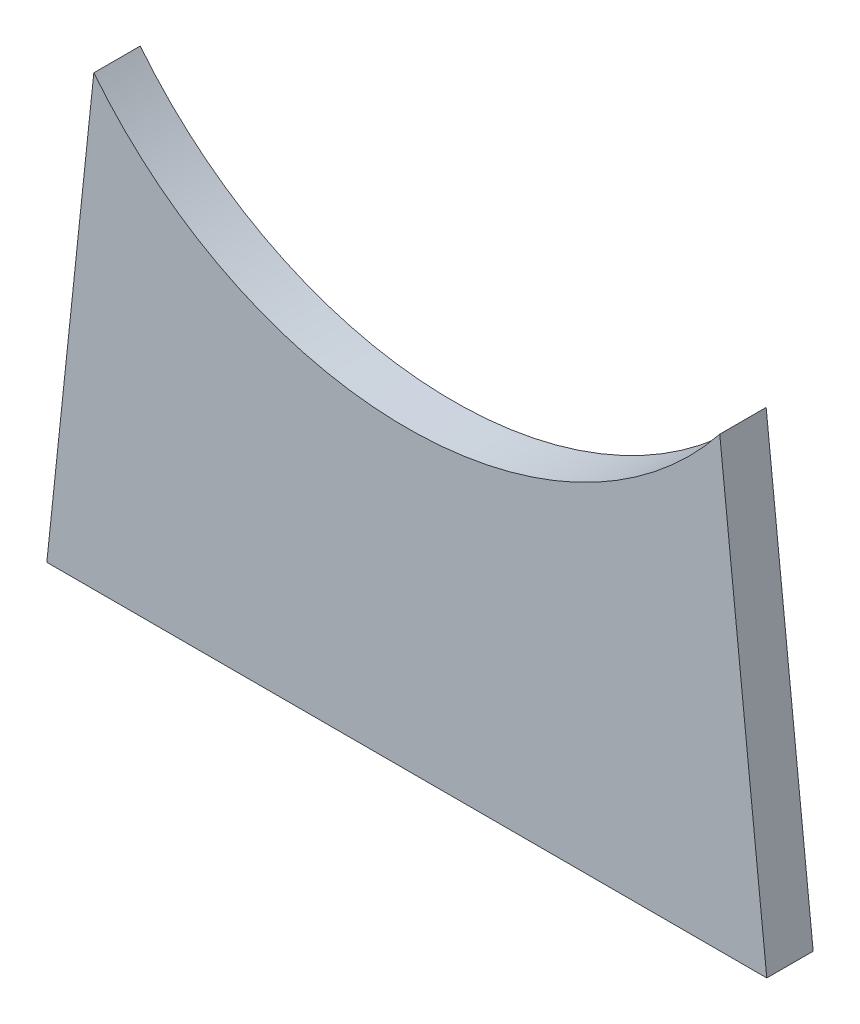
ISO-10303-21;
HEADER;
FILE_DESCRIPTION(('STEP AP214'),'2;1');
FILE_NAME('part.step','',(''),(''),'','','');
FILE_SCHEMA(('AUTOMOTIVE_DESIGN { 1 0 10303 214 1 1 1 1 }'));
ENDSEC;
DATA;
#1=APPLICATION_CONTEXT('core data for automotive mechanical design processes');
#2=APPLICATION_PROTOCOL_DEFINITION('international standard','automotive_design',2000,#1);
#3=PRODUCT_CONTEXT('',#1,'mechanical');
#4=PRODUCT('Part','Part','',(#3));
#5=PRODUCT_RELATED_PRODUCT_CATEGORY('part','',(#4));
#6=PRODUCT_DEFINITION_FORMATION('','',#4);
#7=PRODUCT_DEFINITION_CONTEXT('part definition',#1,'design');
#8=PRODUCT_DEFINITION('design','',#6,#7);
#9=PRODUCT_DEFINITION_SHAPE('','',#8);
#10=(LENGTH_UNIT() NAMED_UNIT(*) SI_UNIT(.MILLI.,.METRE.));
#11=(NAMED_UNIT(*) PLANE_ANGLE_UNIT() SI_UNIT($,.RADIAN.));
#12=(NAMED_UNIT(*) SI_UNIT($,.STERADIAN.) SOLID_ANGLE_UNIT());
#13=UNCERTAINTY_MEASURE_WITH_UNIT(LENGTH_MEASURE(1.E-05),#10,'distance_accuracy_value','');
#14=(GEOMETRIC_REPRESENTATION_CONTEXT(3) GLOBAL_UNCERTAINTY_ASSIGNED_CONTEXT((#13)) GLOBAL_UNIT_ASSIGNED_CONTEXT((#10,
#11,#12)) REPRESENTATION_CONTEXT('',''));
#15=CARTESIAN_POINT('',(0.,0.,0.));
#16=DIRECTION('',(0.,0.,1.));
#17=DIRECTION('',(1.,0.,0.));
#18=AXIS2_PLACEMENT_3D('',#15,#16,#17);
#19=CARTESIAN_POINT('',(-1978.1275,0.,127.5));
#20=DIRECTION('',(0.994521895368273,-0.104528463267658,0.));
#21=DIRECTION('',(0.104528463267658,0.994521895368273,0.));
#22=AXIS2_PLACEMENT_3D('',#19,#20,#21);
#23=PLANE('',#22);
#24=DIRECTION('',(-0.104528463267658,-0.994521895368273,0.));
#25=VECTOR('',#24,1.);
#26=CARTESIAN_POINT('',(-1978.1275,0.,-127.5));
#27=LINE('',#26,#25);
#28=CARTESIAN_POINT('',(-1719.70246154051,2458.75,-127.5));
#29=VERTEX_POINT('',#28);
#30=CARTESIAN_POINT('',(-1978.1275,0.,-127.5));
#31=VERTEX_POINT('',#30);
#32=EDGE_CURVE('E96',#29,#31,#27,.T.);
#33=ORIENTED_EDGE('',*,*,#32,.T.);
#34=DIRECTION('',(0.,0.,-1.));
#35=VECTOR('',#34,1.);
#36=CARTESIAN_POINT('',(-1978.1275,0.,127.5));
#37=LINE('',#36,#35);
#38=CARTESIAN_POINT('',(-1978.1275,0.,127.5));
#39=VERTEX_POINT('',#38);
#40=EDGE_CURVE('E11',#39,#31,#37,.T.);
#41=ORIENTED_EDGE('',*,*,#40,.F.);
#42=DIRECTION('',(-0.104528463267658,-0.994521895368273,0.));
#43=VECTOR('',#42,1.);
#44=CARTESIAN_POINT('',(-1978.1275,0.,127.5));
#45=LINE('',#44,#43);
#46=CARTESIAN_POINT('',(-1719.70246154051,2458.75,127.5));
#47=VERTEX_POINT('',#46);
#48=EDGE_CURVE('E84',#47,#39,#45,.T.);
#49=ORIENTED_EDGE('',*,*,#48,.F.);
#50=DIRECTION('',(0.,0.,-1.));
#51=VECTOR('',#50,1.);
#52=CARTESIAN_POINT('',(-1719.70246154051,2458.75,127.5));
#53=LINE('',#52,#51);
#54=EDGE_CURVE('E92',#47,#29,#53,.T.);
#55=ORIENTED_EDGE('',*,*,#54,.T.);
#56=EDGE_LOOP('',(#33,#41,#49,#55));
#57=FACE_BOUND('',#56,.T.);
#58=ADVANCED_FACE('F33',(#57),#23,.F.);
#59=CARTESIAN_POINT('',(-1978.1275,0.,127.5));
#60=DIRECTION('',(0.,1.,0.));
#61=DIRECTION('',(0.,0.,1.));
#62=AXIS2_PLACEMENT_3D('',#59,#60,#61);
#63=PLANE('',#62);
#64=DIRECTION('',(1.,0.,0.));
#65=VECTOR('',#64,1.);
#66=CARTESIAN_POINT('',(-1978.1275,0.,-127.5));
#67=LINE('',#66,#65);
#68=CARTESIAN_POINT('',(1978.1275,0.,-127.5));
#69=VERTEX_POINT('',#68);
#70=EDGE_CURVE('E88',#31,#69,#67,.T.);
#71=ORIENTED_EDGE('',*,*,#70,.T.);
#72=DIRECTION('',(0.,0.,-1.));
#73=VECTOR('',#72,1.);
#74=CARTESIAN_POINT('',(1978.1275,0.,127.5));
#75=LINE('',#74,#73);
#76=CARTESIAN_POINT('',(1978.1275,0.,127.5));
#77=VERTEX_POINT('',#76);
#78=EDGE_CURVE('E41',#77,#69,#75,.T.);
#79=ORIENTED_EDGE('',*,*,#78,.F.);
#80=DIRECTION('',(1.,0.,0.));
#81=VECTOR('',#80,1.);
#82=CARTESIAN_POINT('',(-1978.1275,0.,127.5));
#83=LINE('',#82,#81);
#84=EDGE_CURVE('E79',#39,#77,#83,.T.);
#85=ORIENTED_EDGE('',*,*,#84,.F.);
#86=ORIENTED_EDGE('',*,*,#40,.T.);
#87=EDGE_LOOP('',(#71,#79,#85,#86));
#88=FACE_BOUND('',#87,.T.);
#89=ADVANCED_FACE('F87',(#88),#63,.F.);
#90=CARTESIAN_POINT('',(1978.1275,0.,127.5));
#91=DIRECTION('',(-0.994521895368273,-0.104528463267658,0.));
#92=DIRECTION('',(0.104528463267658,-0.994521895368273,0.));
#93=AXIS2_PLACEMENT_3D('',#90,#91,#92);
#94=PLANE('',#93);
#95=DIRECTION('',(-0.104528463267658,0.994521895368273,0.));
#96=VECTOR('',#95,1.);
#97=CARTESIAN_POINT('',(1978.1275,0.,-127.5));
#98=LINE('',#97,#96);
#99=CARTESIAN_POINT('',(1719.70246154051,2458.75,-127.5));
#100=VERTEX_POINT('',#99);
#101=EDGE_CURVE('E66',#69,#100,#98,.T.);
#102=ORIENTED_EDGE('',*,*,#101,.T.);
#103=DIRECTION('',(0.,0.,-1.));
#104=VECTOR('',#103,1.);
#105=CARTESIAN_POINT('',(1719.70246154051,2458.75,127.5));
#106=LINE('',#105,#104);
#107=CARTESIAN_POINT('',(1719.70246154051,2458.75,127.5));
#108=VERTEX_POINT('',#107);
#109=EDGE_CURVE('E89',#108,#100,#106,.T.);
#110=ORIENTED_EDGE('',*,*,#109,.F.);
#111=DIRECTION('',(-0.104528463267658,0.994521895368273,0.));
#112=VECTOR('',#111,1.);
#113=CARTESIAN_POINT('',(1978.1275,0.,127.5));
#114=LINE('',#113,#112);
#115=EDGE_CURVE('E82',#77,#108,#114,.T.);
#116=ORIENTED_EDGE('',*,*,#115,.F.);
#117=ORIENTED_EDGE('',*,*,#78,.T.);
#118=EDGE_LOOP('',(#102,#110,#116,#117));
#119=FACE_BOUND('',#118,.T.);
#120=ADVANCED_FACE('F90',(#119),#94,.F.);
#121=CARTESIAN_POINT('',(0.,3824.4466296259,127.5));
#122=DIRECTION('',(0.,0.,-1.));
#123=DIRECTION('',(-1.,0.,0.));
#124=AXIS2_PLACEMENT_3D('',#121,#122,#123);
#125=CYLINDRICAL_SURFACE('',#124,2196.02);
#126=CARTESIAN_POINT('',(0.,3824.4466296259,-127.5));
#127=DIRECTION('',(0.,0.,-1.));
#128=DIRECTION('',(1.,0.,0.));
#129=AXIS2_PLACEMENT_3D('',#126,#127,#128);
#130=CIRCLE('',#129,2196.02);
#131=EDGE_CURVE('E72',#100,#29,#130,.T.);
#132=ORIENTED_EDGE('',*,*,#131,.T.);
#133=ORIENTED_EDGE('',*,*,#54,.F.);
#134=CARTESIAN_POINT('',(0.,3824.4466296259,127.5));
#135=DIRECTION('',(0.,0.,-1.));
#136=DIRECTION('',(1.,0.,0.));
#137=AXIS2_PLACEMENT_3D('',#134,#135,#136);
#138=CIRCLE('',#137,2196.02);
#139=EDGE_CURVE('E49',#108,#47,#138,.T.);
#140=ORIENTED_EDGE('',*,*,#139,.F.);
#141=ORIENTED_EDGE('',*,*,#109,.T.);
#142=EDGE_LOOP('',(#132,#133,#140,#141));
#143=FACE_BOUND('',#142,.T.);
#144=ADVANCED_FACE('F103',(#143),#125,.F.);
#145=CARTESIAN_POINT('',(0.,3824.4466296259,127.5));
#146=DIRECTION('',(0.,0.,1.));
#147=DIRECTION('',(1.,0.,0.));
#148=AXIS2_PLACEMENT_3D('',#145,#146,#147);
#149=PLANE('',#148);
#150=ORIENTED_EDGE('',*,*,#48,.T.);
#151=ORIENTED_EDGE('',*,*,#84,.T.);
#152=ORIENTED_EDGE('',*,*,#115,.T.);
#153=ORIENTED_EDGE('',*,*,#139,.T.);
#154=EDGE_LOOP('',(#150,#151,#152,#153));
#155=FACE_BOUND('',#154,.T.);
#156=ADVANCED_FACE('F80',(#155),#149,.T.);
#157=CARTESIAN_POINT('',(0.,3824.4466296259,-127.5));
#158=DIRECTION('',(0.,0.,1.));
#159=DIRECTION('',(1.,0.,0.));
#160=AXIS2_PLACEMENT_3D('',#157,#158,#159);
#161=PLANE('',#160);
#162=ORIENTED_EDGE('',*,*,#32,.F.);
#163=ORIENTED_EDGE('',*,*,#131,.F.);
#164=ORIENTED_EDGE('',*,*,#101,.F.);
#165=ORIENTED_EDGE('',*,*,#70,.F.);
#166=EDGE_LOOP('',(#162,#163,#164,#165));
#167=FACE_BOUND('',#166,.T.);
#168=ADVANCED_FACE('F106',(#167),#161,.F.);
#169=CLOSED_SHELL('',(#58,#89,#120,#144,#156,#168));
#170=MANIFOLD_SOLID_BREP('B2',#169);
#171=ADVANCED_BREP_SHAPE_REPRESENTATION('',(#18,#170),#14);
#172=SHAPE_DEFINITION_REPRESENTATION(#9,#171);
ENDSEC;
END-ISO-10303-21;
